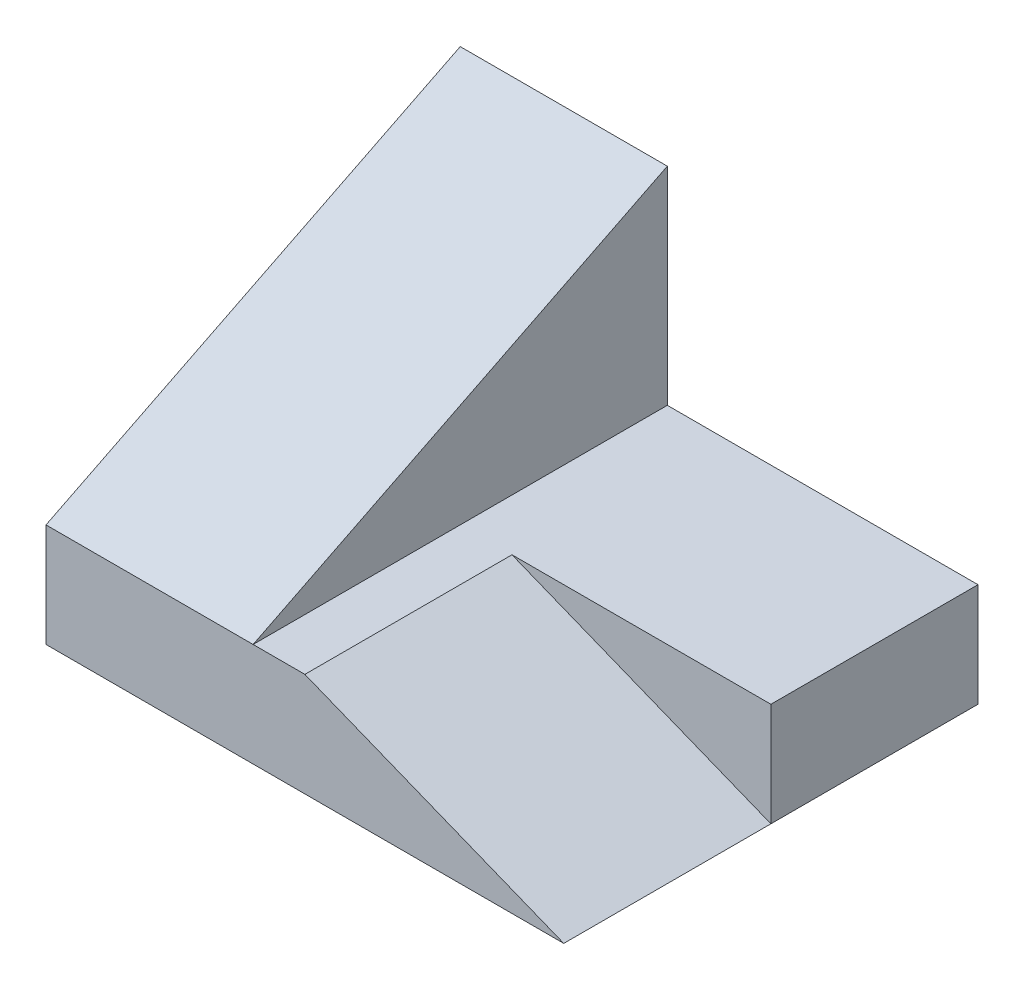
ISO-10303-21;
HEADER;
FILE_DESCRIPTION(('STEP AP214'),'2;1');
FILE_NAME('part.step','',(''),(''),'','','');
FILE_SCHEMA(('AUTOMOTIVE_DESIGN { 1 0 10303 214 1 1 1 1 }'));
ENDSEC;
DATA;
#1=APPLICATION_CONTEXT('core data for automotive mechanical design processes');
#2=APPLICATION_PROTOCOL_DEFINITION('international standard','automotive_design',2000,#1);
#3=PRODUCT_CONTEXT('',#1,'mechanical');
#4=PRODUCT('Part','Part','',(#3));
#5=PRODUCT_RELATED_PRODUCT_CATEGORY('part','',(#4));
#6=PRODUCT_DEFINITION_FORMATION('','',#4);
#7=PRODUCT_DEFINITION_CONTEXT('part definition',#1,'design');
#8=PRODUCT_DEFINITION('design','',#6,#7);
#9=PRODUCT_DEFINITION_SHAPE('','',#8);
#10=(LENGTH_UNIT() NAMED_UNIT(*) SI_UNIT(.MILLI.,.METRE.));
#11=(NAMED_UNIT(*) PLANE_ANGLE_UNIT() SI_UNIT($,.RADIAN.));
#12=(NAMED_UNIT(*) SI_UNIT($,.STERADIAN.) SOLID_ANGLE_UNIT());
#13=UNCERTAINTY_MEASURE_WITH_UNIT(LENGTH_MEASURE(1.E-05),#10,'distance_accuracy_value','');
#14=(GEOMETRIC_REPRESENTATION_CONTEXT(3) GLOBAL_UNCERTAINTY_ASSIGNED_CONTEXT((#13)) GLOBAL_UNIT_ASSIGNED_CONTEXT((#10,
#11,#12)) REPRESENTATION_CONTEXT('',''));
#15=CARTESIAN_POINT('',(0.,0.,0.));
#16=DIRECTION('',(0.,0.,1.));
#17=DIRECTION('',(1.,0.,0.));
#18=AXIS2_PLACEMENT_3D('',#15,#16,#17);
#19=CARTESIAN_POINT('',(25.,10.,-20.));
#20=DIRECTION('',(-1.,0.,0.));
#21=DIRECTION('',(0.,0.,1.));
#22=AXIS2_PLACEMENT_3D('',#19,#20,#21);
#23=PLANE('',#22);
#24=DIRECTION('',(0.,0.,-1.));
#25=VECTOR('',#24,1.);
#26=CARTESIAN_POINT('',(25.,10.,-20.));
#27=LINE('',#26,#25);
#28=CARTESIAN_POINT('',(25.,10.,0.));
#29=VERTEX_POINT('',#28);
#30=CARTESIAN_POINT('',(25.,10.,-20.));
#31=VERTEX_POINT('',#30);
#32=EDGE_CURVE('E56',#29,#31,#27,.T.);
#33=ORIENTED_EDGE('',*,*,#32,.F.);
#34=DIRECTION('',(0.,1.,0.));
#35=VECTOR('',#34,1.);
#36=CARTESIAN_POINT('',(25.,0.,0.));
#37=LINE('',#36,#35);
#38=CARTESIAN_POINT('',(25.,0.,0.));
#39=VERTEX_POINT('',#38);
#40=EDGE_CURVE('E131',#39,#29,#37,.T.);
#41=ORIENTED_EDGE('',*,*,#40,.F.);
#42=DIRECTION('',(0.,0.,-1.));
#43=VECTOR('',#42,1.);
#44=CARTESIAN_POINT('',(25.,0.,-20.));
#45=LINE('',#44,#43);
#46=CARTESIAN_POINT('',(25.,0.,-20.));
#47=VERTEX_POINT('',#46);
#48=EDGE_CURVE('E109',#39,#47,#45,.T.);
#49=ORIENTED_EDGE('',*,*,#48,.T.);
#50=DIRECTION('',(0.,-1.,0.));
#51=VECTOR('',#50,1.);
#52=CARTESIAN_POINT('',(25.,10.,-20.));
#53=LINE('',#52,#51);
#54=EDGE_CURVE('E11',#31,#47,#53,.T.);
#55=ORIENTED_EDGE('',*,*,#54,.F.);
#56=EDGE_LOOP('',(#33,#41,#49,#55));
#57=FACE_BOUND('',#56,.T.);
#58=ADVANCED_FACE('F41',(#57),#23,.F.);
#59=CARTESIAN_POINT('',(-25.,10.,-20.));
#60=DIRECTION('',(0.,0.,1.));
#61=DIRECTION('',(1.,0.,0.));
#62=AXIS2_PLACEMENT_3D('',#59,#60,#61);
#63=PLANE('',#62);
#64=DIRECTION('',(-1.,0.,0.));
#65=VECTOR('',#64,1.);
#66=CARTESIAN_POINT('',(-25.,0.,-20.));
#67=LINE('',#66,#65);
#68=CARTESIAN_POINT('',(-25.,0.,-20.));
#69=VERTEX_POINT('',#68);
#70=EDGE_CURVE('E97',#47,#69,#67,.T.);
#71=ORIENTED_EDGE('',*,*,#70,.T.);
#72=DIRECTION('',(0.,-1.,0.));
#73=VECTOR('',#72,1.);
#74=CARTESIAN_POINT('',(-25.,10.,-20.));
#75=LINE('',#74,#73);
#76=CARTESIAN_POINT('',(-25.,30.,-20.));
#77=VERTEX_POINT('',#76);
#78=EDGE_CURVE('E49',#77,#69,#75,.T.);
#79=ORIENTED_EDGE('',*,*,#78,.F.);
#80=DIRECTION('',(-1.,0.,0.));
#81=VECTOR('',#80,1.);
#82=CARTESIAN_POINT('',(-25.,30.,-20.));
#83=LINE('',#82,#81);
#84=CARTESIAN_POINT('',(-5.00000000000002,30.,-20.));
#85=VERTEX_POINT('',#84);
#86=EDGE_CURVE('E116',#85,#77,#83,.T.);
#87=ORIENTED_EDGE('',*,*,#86,.F.);
#88=DIRECTION('',(0.,-1.,0.));
#89=VECTOR('',#88,1.);
#90=CARTESIAN_POINT('',(-5.00000000000002,30.,-20.));
#91=LINE('',#90,#89);
#92=CARTESIAN_POINT('',(-5.00000000000002,10.,-20.));
#93=VERTEX_POINT('',#92);
#94=EDGE_CURVE('E113',#85,#93,#91,.T.);
#95=ORIENTED_EDGE('',*,*,#94,.T.);
#96=DIRECTION('',(-1.,0.,0.));
#97=VECTOR('',#96,1.);
#98=CARTESIAN_POINT('',(-25.,10.,-20.));
#99=LINE('',#98,#97);
#100=EDGE_CURVE('E104',#31,#93,#99,.T.);
#101=ORIENTED_EDGE('',*,*,#100,.F.);
#102=ORIENTED_EDGE('',*,*,#54,.T.);
#103=EDGE_LOOP('',(#71,#79,#87,#95,#101,#102));
#104=FACE_BOUND('',#103,.T.);
#105=ADVANCED_FACE('F169',(#104),#63,.F.);
#106=CARTESIAN_POINT('',(-25.,10.,-20.));
#107=DIRECTION('',(1.,0.,0.));
#108=DIRECTION('',(0.,0.,-1.));
#109=AXIS2_PLACEMENT_3D('',#106,#107,#108);
#110=PLANE('',#109);
#111=DIRECTION('',(0.,-1.,0.));
#112=VECTOR('',#111,1.);
#113=CARTESIAN_POINT('',(-25.,10.,20.));
#114=LINE('',#113,#112);
#115=CARTESIAN_POINT('',(-25.,10.,20.));
#116=VERTEX_POINT('',#115);
#117=CARTESIAN_POINT('',(-25.,0.,20.));
#118=VERTEX_POINT('',#117);
#119=EDGE_CURVE('E75',#116,#118,#114,.T.);
#120=ORIENTED_EDGE('',*,*,#119,.F.);
#121=DIRECTION('',(0.,0.447213595499958,-0.894427190999916));
#122=VECTOR('',#121,1.);
#123=CARTESIAN_POINT('',(-25.,30.,-20.));
#124=LINE('',#123,#122);
#125=EDGE_CURVE('E123',#116,#77,#124,.T.);
#126=ORIENTED_EDGE('',*,*,#125,.T.);
#127=ORIENTED_EDGE('',*,*,#78,.T.);
#128=DIRECTION('',(0.,0.,1.));
#129=VECTOR('',#128,1.);
#130=CARTESIAN_POINT('',(-25.,0.,-20.));
#131=LINE('',#130,#129);
#132=EDGE_CURVE('E92',#69,#118,#131,.T.);
#133=ORIENTED_EDGE('',*,*,#132,.T.);
#134=EDGE_LOOP('',(#120,#126,#127,#133));
#135=FACE_BOUND('',#134,.T.);
#136=ADVANCED_FACE('F93',(#135),#110,.F.);
#137=CARTESIAN_POINT('',(-25.,10.,20.));
#138=DIRECTION('',(0.,0.,-1.));
#139=DIRECTION('',(-1.,0.,0.));
#140=AXIS2_PLACEMENT_3D('',#137,#138,#139);
#141=PLANE('',#140);
#142=DIRECTION('',(1.,0.,0.));
#143=VECTOR('',#142,1.);
#144=CARTESIAN_POINT('',(-25.,0.,20.));
#145=LINE('',#144,#143);
#146=CARTESIAN_POINT('',(25.,0.,20.));
#147=VERTEX_POINT('',#146);
#148=EDGE_CURVE('E80',#118,#147,#145,.T.);
#149=ORIENTED_EDGE('',*,*,#148,.T.);
#150=DIRECTION('',(0.928476690885259,-0.371390676354104,0.));
#151=VECTOR('',#150,1.);
#152=CARTESIAN_POINT('',(0.,10.,20.));
#153=LINE('',#152,#151);
#154=CARTESIAN_POINT('',(0.,10.,20.));
#155=VERTEX_POINT('',#154);
#156=EDGE_CURVE('E132',#155,#147,#153,.T.);
#157=ORIENTED_EDGE('',*,*,#156,.F.);
#158=DIRECTION('',(1.,0.,0.));
#159=VECTOR('',#158,1.);
#160=CARTESIAN_POINT('',(-25.,10.,20.));
#161=LINE('',#160,#159);
#162=CARTESIAN_POINT('',(-5.00000000000002,10.,20.));
#163=VERTEX_POINT('',#162);
#164=EDGE_CURVE('E88',#163,#155,#161,.T.);
#165=ORIENTED_EDGE('',*,*,#164,.F.);
#166=DIRECTION('',(1.,0.,0.));
#167=VECTOR('',#166,1.);
#168=CARTESIAN_POINT('',(-25.,10.,20.));
#169=LINE('',#168,#167);
#170=EDGE_CURVE('E85',#116,#163,#169,.T.);
#171=ORIENTED_EDGE('',*,*,#170,.F.);
#172=ORIENTED_EDGE('',*,*,#119,.T.);
#173=EDGE_LOOP('',(#149,#157,#165,#171,#172));
#174=FACE_BOUND('',#173,.T.);
#175=ADVANCED_FACE('F77',(#174),#141,.F.);
#176=CARTESIAN_POINT('',(0.,10.,0.));
#177=DIRECTION('',(0.,1.,0.));
#178=DIRECTION('',(0.,0.,1.));
#179=AXIS2_PLACEMENT_3D('',#176,#177,#178);
#180=PLANE('',#179);
#181=DIRECTION('',(0.,0.,1.));
#182=VECTOR('',#181,1.);
#183=CARTESIAN_POINT('',(0.,10.,0.));
#184=LINE('',#183,#182);
#185=CARTESIAN_POINT('',(0.,10.,0.));
#186=VERTEX_POINT('',#185);
#187=EDGE_CURVE('E127',#186,#155,#184,.T.);
#188=ORIENTED_EDGE('',*,*,#187,.F.);
#189=DIRECTION('',(-1.,0.,0.));
#190=VECTOR('',#189,1.);
#191=CARTESIAN_POINT('',(25.,10.,0.));
#192=LINE('',#191,#190);
#193=EDGE_CURVE('E134',#29,#186,#192,.T.);
#194=ORIENTED_EDGE('',*,*,#193,.F.);
#195=ORIENTED_EDGE('',*,*,#32,.T.);
#196=ORIENTED_EDGE('',*,*,#100,.T.);
#197=DIRECTION('',(0.,0.,-1.));
#198=VECTOR('',#197,1.);
#199=CARTESIAN_POINT('',(-5.00000000000002,10.,-20.));
#200=LINE('',#199,#198);
#201=EDGE_CURVE('E117',#163,#93,#200,.T.);
#202=ORIENTED_EDGE('',*,*,#201,.F.);
#203=ORIENTED_EDGE('',*,*,#164,.T.);
#204=EDGE_LOOP('',(#188,#194,#195,#196,#202,#203));
#205=FACE_BOUND('',#204,.T.);
#206=ADVANCED_FACE('F151',(#205),#180,.T.);
#207=CARTESIAN_POINT('',(0.,0.,0.));
#208=DIRECTION('',(0.,1.,0.));
#209=DIRECTION('',(0.,0.,1.));
#210=AXIS2_PLACEMENT_3D('',#207,#208,#209);
#211=PLANE('',#210);
#212=EDGE_CURVE('E102',#147,#39,#45,.T.);
#213=ORIENTED_EDGE('',*,*,#212,.F.);
#214=ORIENTED_EDGE('',*,*,#148,.F.);
#215=ORIENTED_EDGE('',*,*,#132,.F.);
#216=ORIENTED_EDGE('',*,*,#70,.F.);
#217=ORIENTED_EDGE('',*,*,#48,.F.);
#218=EDGE_LOOP('',(#213,#214,#215,#216,#217));
#219=FACE_BOUND('',#218,.T.);
#220=ADVANCED_FACE('F99',(#219),#211,.F.);
#221=CARTESIAN_POINT('',(-5.00000000000002,30.,-20.));
#222=DIRECTION('',(-1.,0.,0.));
#223=DIRECTION('',(0.,0.,1.));
#224=AXIS2_PLACEMENT_3D('',#221,#222,#223);
#225=PLANE('',#224);
#226=ORIENTED_EDGE('',*,*,#94,.F.);
#227=DIRECTION('',(0.,0.447213595499958,-0.894427190999916));
#228=VECTOR('',#227,1.);
#229=CARTESIAN_POINT('',(-5.00000000000002,30.,-20.));
#230=LINE('',#229,#228);
#231=EDGE_CURVE('E124',#163,#85,#230,.T.);
#232=ORIENTED_EDGE('',*,*,#231,.F.);
#233=ORIENTED_EDGE('',*,*,#201,.T.);
#234=EDGE_LOOP('',(#226,#232,#233));
#235=FACE_BOUND('',#234,.T.);
#236=ADVANCED_FACE('F187',(#235),#225,.F.);
#237=CARTESIAN_POINT('',(-25.,30.,-20.));
#238=DIRECTION('',(0.,-0.894427190999916,-0.447213595499958));
#239=DIRECTION('',(0.,0.447213595499958,-0.894427190999916));
#240=AXIS2_PLACEMENT_3D('',#237,#238,#239);
#241=PLANE('',#240);
#242=ORIENTED_EDGE('',*,*,#231,.T.);
#243=ORIENTED_EDGE('',*,*,#86,.T.);
#244=ORIENTED_EDGE('',*,*,#125,.F.);
#245=ORIENTED_EDGE('',*,*,#170,.T.);
#246=EDGE_LOOP('',(#242,#243,#244,#245));
#247=FACE_BOUND('',#246,.T.);
#248=ADVANCED_FACE('F167',(#247),#241,.F.);
#249=CARTESIAN_POINT('',(0.,10.,0.));
#250=DIRECTION('',(-0.371390676354104,-0.928476690885259,0.));
#251=DIRECTION('',(0.928476690885259,-0.371390676354104,0.));
#252=AXIS2_PLACEMENT_3D('',#249,#250,#251);
#253=PLANE('',#252);
#254=ORIENTED_EDGE('',*,*,#156,.T.);
#255=ORIENTED_EDGE('',*,*,#212,.T.);
#256=DIRECTION('',(0.928476690885259,-0.371390676354104,0.));
#257=VECTOR('',#256,1.);
#258=CARTESIAN_POINT('',(0.,10.,0.));
#259=LINE('',#258,#257);
#260=EDGE_CURVE('E137',#186,#39,#259,.T.);
#261=ORIENTED_EDGE('',*,*,#260,.F.);
#262=ORIENTED_EDGE('',*,*,#187,.T.);
#263=EDGE_LOOP('',(#254,#255,#261,#262));
#264=FACE_BOUND('',#263,.T.);
#265=ADVANCED_FACE('F154',(#264),#253,.F.);
#266=CARTESIAN_POINT('',(0.,0.,0.));
#267=DIRECTION('',(0.,0.,-1.));
#268=DIRECTION('',(-1.,0.,0.));
#269=AXIS2_PLACEMENT_3D('',#266,#267,#268);
#270=PLANE('',#269);
#271=ORIENTED_EDGE('',*,*,#193,.T.);
#272=ORIENTED_EDGE('',*,*,#260,.T.);
#273=ORIENTED_EDGE('',*,*,#40,.T.);
#274=EDGE_LOOP('',(#271,#272,#273));
#275=FACE_BOUND('',#274,.T.);
#276=ADVANCED_FACE('F144',(#275),#270,.F.);
#277=CLOSED_SHELL('',(#58,#105,#136,#175,#206,#220,#236,#248,#265,#276));
#278=MANIFOLD_SOLID_BREP('B2',#277);
#279=ADVANCED_BREP_SHAPE_REPRESENTATION('',(#18,#278),#14);
#280=SHAPE_DEFINITION_REPRESENTATION(#9,#279);
ENDSEC;
END-ISO-10303-21;
